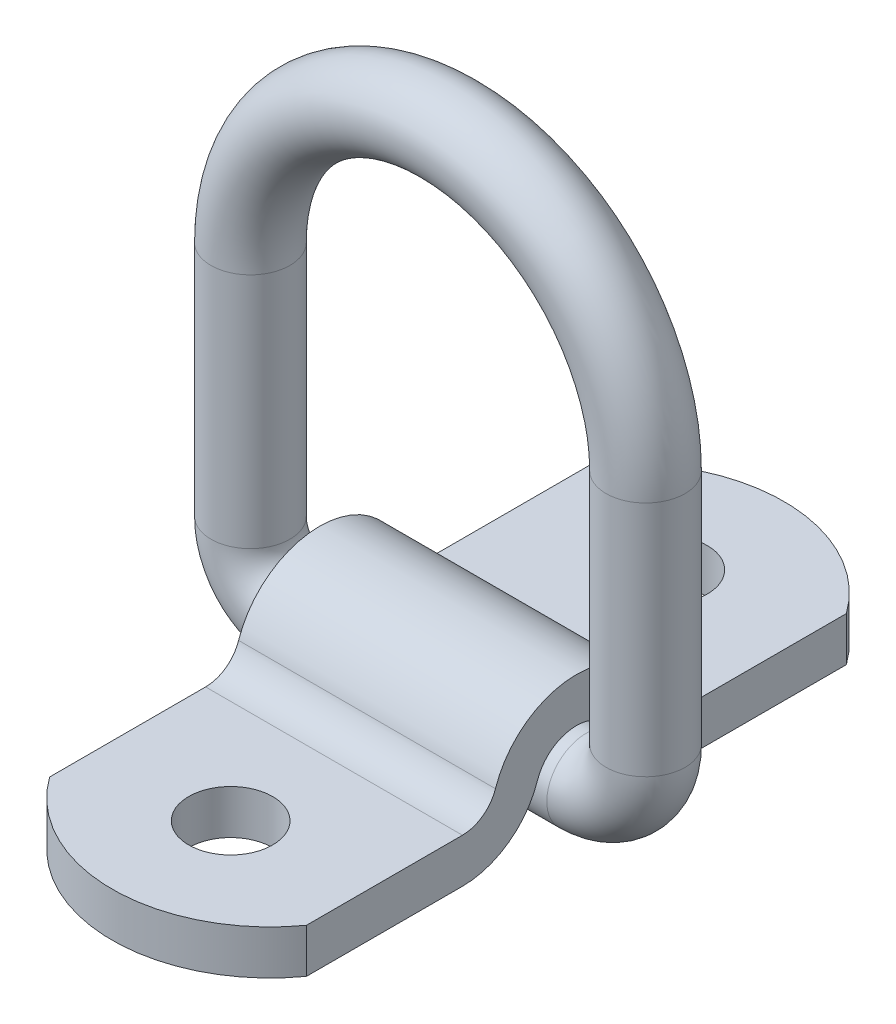
ISO-10303-21;
HEADER;
FILE_DESCRIPTION(('STEP AP214'),'2;1');
FILE_NAME('part.step','',(''),(''),'','','');
FILE_SCHEMA(('AUTOMOTIVE_DESIGN { 1 0 10303 214 1 1 1 1 }'));
ENDSEC;
DATA;
#1=APPLICATION_CONTEXT('core data for automotive mechanical design processes');
#2=APPLICATION_PROTOCOL_DEFINITION('international standard','automotive_design',2000,#1);
#3=PRODUCT_CONTEXT('',#1,'mechanical');
#4=PRODUCT('Part','Part','',(#3));
#5=PRODUCT_RELATED_PRODUCT_CATEGORY('part','',(#4));
#6=PRODUCT_DEFINITION_FORMATION('','',#4);
#7=PRODUCT_DEFINITION_CONTEXT('part definition',#1,'design');
#8=PRODUCT_DEFINITION('design','',#6,#7);
#9=PRODUCT_DEFINITION_SHAPE('','',#8);
#10=(LENGTH_UNIT() NAMED_UNIT(*) SI_UNIT(.MILLI.,.METRE.));
#11=(NAMED_UNIT(*) PLANE_ANGLE_UNIT() SI_UNIT($,.RADIAN.));
#12=(NAMED_UNIT(*) SI_UNIT($,.STERADIAN.) SOLID_ANGLE_UNIT());
#13=UNCERTAINTY_MEASURE_WITH_UNIT(LENGTH_MEASURE(1.E-05),#10,'distance_accuracy_value','');
#14=(GEOMETRIC_REPRESENTATION_CONTEXT(3) GLOBAL_UNCERTAINTY_ASSIGNED_CONTEXT((#13)) GLOBAL_UNIT_ASSIGNED_CONTEXT((#10,
#11,#12)) REPRESENTATION_CONTEXT('',''));
#15=CARTESIAN_POINT('',(0.,0.,0.));
#16=DIRECTION('',(0.,0.,1.));
#17=DIRECTION('',(1.,0.,0.));
#18=AXIS2_PLACEMENT_3D('',#15,#16,#17);
#19=CARTESIAN_POINT('',(10.31875,-3.302,26.9875));
#20=DIRECTION('',(0.,1.,0.));
#21=DIRECTION('',(0.,0.,1.));
#22=AXIS2_PLACEMENT_3D('',#19,#20,#21);
#23=PLANE('',#22);
#24=CARTESIAN_POINT('',(0.,-3.302,17.4625));
#25=DIRECTION('',(0.,-1.,0.));
#26=DIRECTION('',(0.,0.,-1.));
#27=AXIS2_PLACEMENT_3D('',#24,#25,#26);
#28=CIRCLE('',#27,3.3734375);
#29=CARTESIAN_POINT('',(0.,-3.302,14.0890625));
#30=VERTEX_POINT('',#29);
#31=EDGE_CURVE('E211',#30,#30,#28,.T.);
#32=ORIENTED_EDGE('',*,*,#31,.F.);
#33=EDGE_LOOP('',(#32));
#34=FACE_BOUND('',#33,.T.);
#35=CARTESIAN_POINT('',(0.,-3.302,14.2875));
#36=DIRECTION('',(0.,1.,0.));
#37=DIRECTION('',(0.,0.,-1.));
#38=AXIS2_PLACEMENT_3D('',#35,#36,#37);
#39=CIRCLE('',#38,12.7);
#40=CARTESIAN_POINT('',(-10.31875,-3.302,21.6911071233893));
#41=VERTEX_POINT('',#40);
#42=CARTESIAN_POINT('',(10.31875,-3.302,21.6911071233892));
#43=VERTEX_POINT('',#42);
#44=EDGE_CURVE('E210',#41,#43,#39,.T.);
#45=ORIENTED_EDGE('',*,*,#44,.F.);
#46=DIRECTION('',(0.,0.,-1.));
#47=VECTOR('',#46,1.);
#48=CARTESIAN_POINT('',(-10.31875,-3.302,26.9875));
#49=LINE('',#48,#47);
#50=CARTESIAN_POINT('',(-10.31875,-3.302,9.15810023967853));
#51=VERTEX_POINT('',#50);
#52=EDGE_CURVE('E164',#41,#51,#49,.T.);
#53=ORIENTED_EDGE('',*,*,#52,.T.);
#54=DIRECTION('',(-1.,0.,0.));
#55=VECTOR('',#54,1.);
#56=CARTESIAN_POINT('',(10.31875,-3.302,9.15810023967853));
#57=LINE('',#56,#55);
#58=CARTESIAN_POINT('',(10.31875,-3.302,9.15810023967853));
#59=VERTEX_POINT('',#58);
#60=EDGE_CURVE('E204',#59,#51,#57,.T.);
#61=ORIENTED_EDGE('',*,*,#60,.F.);
#62=DIRECTION('',(0.,0.,-1.));
#63=VECTOR('',#62,1.);
#64=CARTESIAN_POINT('',(10.31875,-3.302,26.9875));
#65=LINE('',#64,#63);
#66=EDGE_CURVE('E184',#43,#59,#65,.T.);
#67=ORIENTED_EDGE('',*,*,#66,.F.);
#68=EDGE_LOOP('',(#45,#53,#61,#67));
#69=FACE_BOUND('',#68,.T.);
#70=ADVANCED_FACE('F40',(#34,#69),#23,.F.);
#71=CARTESIAN_POINT('',(10.31875,3.048,9.15810023967853));
#72=DIRECTION('',(-1.,0.,0.));
#73=DIRECTION('',(0.,0.,1.));
#74=AXIS2_PLACEMENT_3D('',#71,#72,#73);
#75=CYLINDRICAL_SURFACE('',#74,6.35);
#76=CARTESIAN_POINT('',(-10.31875,3.048,9.15810023967853));
#77=DIRECTION('',(1.,0.,0.));
#78=DIRECTION('',(0.,0.,-1.));
#79=AXIS2_PLACEMENT_3D('',#76,#77,#78);
#80=CIRCLE('',#79,6.35);
#81=CARTESIAN_POINT('',(-10.31875,1.04273684210526,3.1330342925216));
#82=VERTEX_POINT('',#81);
#83=EDGE_CURVE('E166',#51,#82,#80,.T.);
#84=ORIENTED_EDGE('',*,*,#83,.T.);
#85=DIRECTION('',(-1.,0.,0.));
#86=VECTOR('',#85,1.);
#87=CARTESIAN_POINT('',(10.31875,1.04273684210526,3.1330342925216));
#88=LINE('',#87,#86);
#89=CARTESIAN_POINT('',(10.31875,1.04273684210526,3.1330342925216));
#90=VERTEX_POINT('',#89);
#91=EDGE_CURVE('E201',#90,#82,#88,.T.);
#92=ORIENTED_EDGE('',*,*,#91,.F.);
#93=CARTESIAN_POINT('',(10.31875,3.048,9.15810023967853));
#94=DIRECTION('',(1.,0.,0.));
#95=DIRECTION('',(0.,0.,-1.));
#96=AXIS2_PLACEMENT_3D('',#93,#94,#95);
#97=CIRCLE('',#96,6.35);
#98=EDGE_CURVE('E231',#59,#90,#97,.T.);
#99=ORIENTED_EDGE('',*,*,#98,.F.);
#100=ORIENTED_EDGE('',*,*,#60,.T.);
#101=EDGE_LOOP('',(#84,#92,#99,#100));
#102=FACE_BOUND('',#101,.T.);
#103=ADVANCED_FACE('F274',(#102),#75,.T.);
#104=CARTESIAN_POINT('',(10.31875,0.,0.));
#105=DIRECTION('',(-1.,0.,0.));
#106=DIRECTION('',(0.,0.,1.));
#107=AXIS2_PLACEMENT_3D('',#104,#105,#106);
#108=CYLINDRICAL_SURFACE('',#107,3.302);
#109=CARTESIAN_POINT('',(-10.31875,0.,0.));
#110=DIRECTION('',(-1.,0.,0.));
#111=DIRECTION('',(0.,0.,1.));
#112=AXIS2_PLACEMENT_3D('',#109,#110,#111);
#113=CIRCLE('',#112,3.302);
#114=CARTESIAN_POINT('',(-10.31875,1.04273684210526,-3.13303429252161));
#115=VERTEX_POINT('',#114);
#116=EDGE_CURVE('E168',#82,#115,#113,.T.);
#117=ORIENTED_EDGE('',*,*,#116,.T.);
#118=DIRECTION('',(-1.,0.,0.));
#119=VECTOR('',#118,1.);
#120=CARTESIAN_POINT('',(10.31875,1.04273684210526,-3.13303429252161));
#121=LINE('',#120,#119);
#122=CARTESIAN_POINT('',(10.31875,1.04273684210526,-3.13303429252161));
#123=VERTEX_POINT('',#122);
#124=EDGE_CURVE('E198',#123,#115,#121,.T.);
#125=ORIENTED_EDGE('',*,*,#124,.F.);
#126=CARTESIAN_POINT('',(10.31875,0.,0.));
#127=DIRECTION('',(-1.,0.,0.));
#128=DIRECTION('',(0.,0.,1.));
#129=AXIS2_PLACEMENT_3D('',#126,#127,#128);
#130=CIRCLE('',#129,3.302);
#131=EDGE_CURVE('E151',#90,#123,#130,.T.);
#132=ORIENTED_EDGE('',*,*,#131,.F.);
#133=ORIENTED_EDGE('',*,*,#91,.T.);
#134=EDGE_LOOP('',(#117,#125,#132,#133));
#135=FACE_BOUND('',#134,.T.);
#136=ADVANCED_FACE('F237',(#135),#108,.F.);
#137=CARTESIAN_POINT('',(10.31875,3.048,-9.15810023967853));
#138=DIRECTION('',(-1.,0.,0.));
#139=DIRECTION('',(0.,0.,1.));
#140=AXIS2_PLACEMENT_3D('',#137,#138,#139);
#141=CYLINDRICAL_SURFACE('',#140,6.35);
#142=CARTESIAN_POINT('',(-10.31875,3.048,-9.15810023967853));
#143=DIRECTION('',(1.,0.,0.));
#144=DIRECTION('',(0.,0.,1.));
#145=AXIS2_PLACEMENT_3D('',#142,#143,#144);
#146=CIRCLE('',#145,6.35);
#147=CARTESIAN_POINT('',(-10.31875,-3.302,-9.15810023967853));
#148=VERTEX_POINT('',#147);
#149=EDGE_CURVE('E170',#115,#148,#146,.T.);
#150=ORIENTED_EDGE('',*,*,#149,.T.);
#151=DIRECTION('',(-1.,0.,0.));
#152=VECTOR('',#151,1.);
#153=CARTESIAN_POINT('',(10.31875,-3.302,-9.15810023967853));
#154=LINE('',#153,#152);
#155=CARTESIAN_POINT('',(10.31875,-3.302,-9.15810023967853));
#156=VERTEX_POINT('',#155);
#157=EDGE_CURVE('E196',#156,#148,#154,.T.);
#158=ORIENTED_EDGE('',*,*,#157,.F.);
#159=CARTESIAN_POINT('',(10.31875,3.048,-9.15810023967853));
#160=DIRECTION('',(1.,0.,0.));
#161=DIRECTION('',(0.,0.,1.));
#162=AXIS2_PLACEMENT_3D('',#159,#160,#161);
#163=CIRCLE('',#162,6.35);
#164=EDGE_CURVE('E145',#123,#156,#163,.T.);
#165=ORIENTED_EDGE('',*,*,#164,.F.);
#166=ORIENTED_EDGE('',*,*,#124,.T.);
#167=EDGE_LOOP('',(#150,#158,#165,#166));
#168=FACE_BOUND('',#167,.T.);
#169=ADVANCED_FACE('F241',(#168),#141,.T.);
#170=CARTESIAN_POINT('',(10.31875,-3.30199999999999,-26.9875));
#171=DIRECTION('',(0.,1.,0.));
#172=DIRECTION('',(0.,0.,1.));
#173=AXIS2_PLACEMENT_3D('',#170,#171,#172);
#174=PLANE('',#173);
#175=CARTESIAN_POINT('',(0.,-3.302,-17.4625));
#176=DIRECTION('',(0.,-1.,0.));
#177=DIRECTION('',(0.,0.,1.));
#178=AXIS2_PLACEMENT_3D('',#175,#176,#177);
#179=CIRCLE('',#178,3.3734375);
#180=CARTESIAN_POINT('',(0.,-3.302,-14.0890625));
#181=VERTEX_POINT('',#180);
#182=EDGE_CURVE('E214',#181,#181,#179,.T.);
#183=ORIENTED_EDGE('',*,*,#182,.F.);
#184=EDGE_LOOP('',(#183));
#185=FACE_BOUND('',#184,.T.);
#186=DIRECTION('',(0.,0.,-1.));
#187=VECTOR('',#186,1.);
#188=CARTESIAN_POINT('',(-10.31875,-3.30199999999999,-26.9875));
#189=LINE('',#188,#187);
#190=CARTESIAN_POINT('',(-10.31875,-3.302,-21.6911071233892));
#191=VERTEX_POINT('',#190);
#192=EDGE_CURVE('E141',#148,#191,#189,.T.);
#193=ORIENTED_EDGE('',*,*,#192,.T.);
#194=CARTESIAN_POINT('',(0.,-3.302,-14.2875));
#195=DIRECTION('',(0.,1.,0.));
#196=DIRECTION('',(0.,0.,1.));
#197=AXIS2_PLACEMENT_3D('',#194,#195,#196);
#198=CIRCLE('',#197,12.7);
#199=CARTESIAN_POINT('',(10.31875,-3.302,-21.6911071233892));
#200=VERTEX_POINT('',#199);
#201=EDGE_CURVE('E54',#200,#191,#198,.T.);
#202=ORIENTED_EDGE('',*,*,#201,.F.);
#203=DIRECTION('',(0.,0.,-1.));
#204=VECTOR('',#203,1.);
#205=CARTESIAN_POINT('',(10.31875,-3.30199999999999,-26.9875));
#206=LINE('',#205,#204);
#207=EDGE_CURVE('E139',#156,#200,#206,.T.);
#208=ORIENTED_EDGE('',*,*,#207,.F.);
#209=ORIENTED_EDGE('',*,*,#157,.T.);
#210=EDGE_LOOP('',(#193,#202,#208,#209));
#211=FACE_BOUND('',#210,.T.);
#212=ADVANCED_FACE('F137',(#185,#211),#174,.F.);
#213=CARTESIAN_POINT('',(10.31875,0.254000000000007,-26.9875));
#214=DIRECTION('',(0.,-1.,0.));
#215=DIRECTION('',(0.,0.,-1.));
#216=AXIS2_PLACEMENT_3D('',#213,#214,#215);
#217=PLANE('',#216);
#218=CARTESIAN_POINT('',(0.,0.254000000000004,-17.4625));
#219=DIRECTION('',(0.,-1.,0.));
#220=DIRECTION('',(0.,0.,-1.));
#221=AXIS2_PLACEMENT_3D('',#218,#219,#220);
#222=CIRCLE('',#221,3.3734375);
#223=CARTESIAN_POINT('',(0.,0.254000000000005,-20.8359375));
#224=VERTEX_POINT('',#223);
#225=EDGE_CURVE('E212',#224,#224,#222,.T.);
#226=ORIENTED_EDGE('',*,*,#225,.T.);
#227=EDGE_LOOP('',(#226));
#228=FACE_BOUND('',#227,.T.);
#229=DIRECTION('',(0.,0.,1.));
#230=VECTOR('',#229,1.);
#231=CARTESIAN_POINT('',(10.31875,0.254000000000007,-26.9875));
#232=LINE('',#231,#230);
#233=CARTESIAN_POINT('',(10.31875,0.254000000000004,-21.6911071233892));
#234=VERTEX_POINT('',#233);
#235=CARTESIAN_POINT('',(10.31875,0.254000000000002,-9.15810023967853));
#236=VERTEX_POINT('',#235);
#237=EDGE_CURVE('E147',#234,#236,#232,.T.);
#238=ORIENTED_EDGE('',*,*,#237,.F.);
#239=CARTESIAN_POINT('',(0.,0.254000000000004,-14.2875));
#240=DIRECTION('',(0.,-1.,0.));
#241=DIRECTION('',(0.,0.,-1.));
#242=AXIS2_PLACEMENT_3D('',#239,#240,#241);
#243=CIRCLE('',#242,12.7);
#244=CARTESIAN_POINT('',(-10.31875,0.254000000000004,-21.6911071233893));
#245=VERTEX_POINT('',#244);
#246=EDGE_CURVE('E129',#234,#245,#243,.F.);
#247=ORIENTED_EDGE('',*,*,#246,.T.);
#248=DIRECTION('',(0.,0.,1.));
#249=VECTOR('',#248,1.);
#250=CARTESIAN_POINT('',(-10.31875,0.254000000000007,-26.9875));
#251=LINE('',#250,#249);
#252=CARTESIAN_POINT('',(-10.31875,0.254000000000002,-9.15810023967853));
#253=VERTEX_POINT('',#252);
#254=EDGE_CURVE('E173',#245,#253,#251,.T.);
#255=ORIENTED_EDGE('',*,*,#254,.T.);
#256=DIRECTION('',(-1.,0.,0.));
#257=VECTOR('',#256,1.);
#258=CARTESIAN_POINT('',(10.31875,0.254000000000002,-9.15810023967853));
#259=LINE('',#258,#257);
#260=EDGE_CURVE('E193',#236,#253,#259,.T.);
#261=ORIENTED_EDGE('',*,*,#260,.F.);
#262=EDGE_LOOP('',(#238,#247,#255,#261));
#263=FACE_BOUND('',#262,.T.);
#264=ADVANCED_FACE('F247',(#228,#263),#217,.F.);
#265=CARTESIAN_POINT('',(10.31875,3.048,-9.15810023967853));
#266=DIRECTION('',(-1.,0.,0.));
#267=DIRECTION('',(0.,0.,1.));
#268=AXIS2_PLACEMENT_3D('',#265,#266,#267);
#269=CYLINDRICAL_SURFACE('',#268,2.794);
#270=CARTESIAN_POINT('',(-10.31875,3.048,-9.15810023967853));
#271=DIRECTION('',(-1.,0.,0.));
#272=DIRECTION('',(0.,0.,1.));
#273=AXIS2_PLACEMENT_3D('',#270,#271,#272);
#274=CIRCLE('',#273,2.794);
#275=CARTESIAN_POINT('',(-10.31875,2.16568421052631,-6.50707122292949));
#276=VERTEX_POINT('',#275);
#277=EDGE_CURVE('E175',#253,#276,#274,.T.);
#278=ORIENTED_EDGE('',*,*,#277,.T.);
#279=DIRECTION('',(-1.,0.,0.));
#280=VECTOR('',#279,1.);
#281=CARTESIAN_POINT('',(10.31875,2.16568421052631,-6.50707122292949));
#282=LINE('',#281,#280);
#283=CARTESIAN_POINT('',(10.31875,2.16568421052631,-6.50707122292949));
#284=VERTEX_POINT('',#283);
#285=EDGE_CURVE('E190',#284,#276,#282,.T.);
#286=ORIENTED_EDGE('',*,*,#285,.F.);
#287=CARTESIAN_POINT('',(10.31875,3.048,-9.15810023967853));
#288=DIRECTION('',(-1.,0.,0.));
#289=DIRECTION('',(0.,0.,1.));
#290=AXIS2_PLACEMENT_3D('',#287,#288,#289);
#291=CIRCLE('',#290,2.794);
#292=EDGE_CURVE('E149',#236,#284,#291,.T.);
#293=ORIENTED_EDGE('',*,*,#292,.F.);
#294=ORIENTED_EDGE('',*,*,#260,.T.);
#295=EDGE_LOOP('',(#278,#286,#293,#294));
#296=FACE_BOUND('',#295,.T.);
#297=ADVANCED_FACE('F254',(#296),#269,.F.);
#298=CARTESIAN_POINT('',(10.31875,0.,0.));
#299=DIRECTION('',(-1.,0.,0.));
#300=DIRECTION('',(0.,0.,1.));
#301=AXIS2_PLACEMENT_3D('',#298,#299,#300);
#302=CYLINDRICAL_SURFACE('',#301,6.858);
#303=CARTESIAN_POINT('',(-10.31875,0.,0.));
#304=DIRECTION('',(1.,0.,0.));
#305=DIRECTION('',(0.,0.,1.));
#306=AXIS2_PLACEMENT_3D('',#303,#304,#305);
#307=CIRCLE('',#306,6.858);
#308=CARTESIAN_POINT('',(-10.31875,2.16568421052631,6.50707122292949));
#309=VERTEX_POINT('',#308);
#310=EDGE_CURVE('E177',#276,#309,#307,.T.);
#311=ORIENTED_EDGE('',*,*,#310,.T.);
#312=DIRECTION('',(-1.,0.,0.));
#313=VECTOR('',#312,1.);
#314=CARTESIAN_POINT('',(10.31875,2.16568421052631,6.50707122292949));
#315=LINE('',#314,#313);
#316=CARTESIAN_POINT('',(10.31875,2.16568421052631,6.50707122292949));
#317=VERTEX_POINT('',#316);
#318=EDGE_CURVE('E187',#317,#309,#315,.T.);
#319=ORIENTED_EDGE('',*,*,#318,.F.);
#320=CARTESIAN_POINT('',(10.31875,0.,0.));
#321=DIRECTION('',(1.,0.,0.));
#322=DIRECTION('',(0.,0.,1.));
#323=AXIS2_PLACEMENT_3D('',#320,#321,#322);
#324=CIRCLE('',#323,6.858);
#325=EDGE_CURVE('E156',#284,#317,#324,.T.);
#326=ORIENTED_EDGE('',*,*,#325,.F.);
#327=ORIENTED_EDGE('',*,*,#285,.T.);
#328=EDGE_LOOP('',(#311,#319,#326,#327));
#329=FACE_BOUND('',#328,.T.);
#330=ADVANCED_FACE('F257',(#329),#302,.T.);
#331=CARTESIAN_POINT('',(10.31875,3.048,9.15810023967853));
#332=DIRECTION('',(-1.,0.,0.));
#333=DIRECTION('',(0.,0.,1.));
#334=AXIS2_PLACEMENT_3D('',#331,#332,#333);
#335=CYLINDRICAL_SURFACE('',#334,2.794);
#336=CARTESIAN_POINT('',(-10.31875,3.048,9.15810023967853));
#337=DIRECTION('',(-1.,0.,0.));
#338=DIRECTION('',(0.,0.,-1.));
#339=AXIS2_PLACEMENT_3D('',#336,#337,#338);
#340=CIRCLE('',#339,2.794);
#341=CARTESIAN_POINT('',(-10.31875,0.254,9.15810023967853));
#342=VERTEX_POINT('',#341);
#343=EDGE_CURVE('E179',#309,#342,#340,.T.);
#344=ORIENTED_EDGE('',*,*,#343,.T.);
#345=DIRECTION('',(-1.,0.,0.));
#346=VECTOR('',#345,1.);
#347=CARTESIAN_POINT('',(10.31875,0.254,9.15810023967853));
#348=LINE('',#347,#346);
#349=CARTESIAN_POINT('',(10.31875,0.254,9.15810023967853));
#350=VERTEX_POINT('',#349);
#351=EDGE_CURVE('E163',#350,#342,#348,.T.);
#352=ORIENTED_EDGE('',*,*,#351,.F.);
#353=CARTESIAN_POINT('',(10.31875,3.048,9.15810023967853));
#354=DIRECTION('',(-1.,0.,0.));
#355=DIRECTION('',(0.,0.,-1.));
#356=AXIS2_PLACEMENT_3D('',#353,#354,#355);
#357=CIRCLE('',#356,2.794);
#358=EDGE_CURVE('E158',#317,#350,#357,.T.);
#359=ORIENTED_EDGE('',*,*,#358,.F.);
#360=ORIENTED_EDGE('',*,*,#318,.T.);
#361=EDGE_LOOP('',(#344,#352,#359,#360));
#362=FACE_BOUND('',#361,.T.);
#363=ADVANCED_FACE('F262',(#362),#335,.F.);
#364=CARTESIAN_POINT('',(10.31875,0.254,26.9875));
#365=DIRECTION('',(0.,-1.,0.));
#366=DIRECTION('',(0.,0.,-1.));
#367=AXIS2_PLACEMENT_3D('',#364,#365,#366);
#368=PLANE('',#367);
#369=CARTESIAN_POINT('',(0.,0.253999999999997,17.4625));
#370=DIRECTION('',(0.,-1.,0.));
#371=DIRECTION('',(0.,0.,-1.));
#372=AXIS2_PLACEMENT_3D('',#369,#370,#371);
#373=CIRCLE('',#372,3.3734375);
#374=CARTESIAN_POINT('',(0.,0.253999999999997,14.0890625));
#375=VERTEX_POINT('',#374);
#376=EDGE_CURVE('E208',#375,#375,#373,.T.);
#377=ORIENTED_EDGE('',*,*,#376,.T.);
#378=EDGE_LOOP('',(#377));
#379=FACE_BOUND('',#378,.T.);
#380=DIRECTION('',(0.,0.,1.));
#381=VECTOR('',#380,1.);
#382=CARTESIAN_POINT('',(-10.31875,0.254,26.9875));
#383=LINE('',#382,#381);
#384=CARTESIAN_POINT('',(-10.31875,0.254,21.6911071233893));
#385=VERTEX_POINT('',#384);
#386=EDGE_CURVE('E181',#342,#385,#383,.T.);
#387=ORIENTED_EDGE('',*,*,#386,.T.);
#388=CARTESIAN_POINT('',(0.,0.253999999999997,14.2875));
#389=DIRECTION('',(0.,-1.,0.));
#390=DIRECTION('',(0.,0.,-1.));
#391=AXIS2_PLACEMENT_3D('',#388,#389,#390);
#392=CIRCLE('',#391,12.7);
#393=CARTESIAN_POINT('',(10.31875,0.253999999999997,21.6911071233892));
#394=VERTEX_POINT('',#393);
#395=EDGE_CURVE('E61',#385,#394,#392,.F.);
#396=ORIENTED_EDGE('',*,*,#395,.T.);
#397=DIRECTION('',(0.,0.,1.));
#398=VECTOR('',#397,1.);
#399=CARTESIAN_POINT('',(10.31875,0.254,26.9875));
#400=LINE('',#399,#398);
#401=EDGE_CURVE('E160',#350,#394,#400,.T.);
#402=ORIENTED_EDGE('',*,*,#401,.F.);
#403=ORIENTED_EDGE('',*,*,#351,.T.);
#404=EDGE_LOOP('',(#387,#396,#402,#403));
#405=FACE_BOUND('',#404,.T.);
#406=ADVANCED_FACE('F266',(#379,#405),#368,.F.);
#407=CARTESIAN_POINT('',(10.31875,3.048,9.15810023967853));
#408=DIRECTION('',(1.,0.,0.));
#409=DIRECTION('',(0.,0.,-1.));
#410=AXIS2_PLACEMENT_3D('',#407,#408,#409);
#411=PLANE('',#410);
#412=DIRECTION('',(0.,-1.,0.));
#413=VECTOR('',#412,1.);
#414=CARTESIAN_POINT('',(10.31875,42.8625,-21.6911071233892));
#415=LINE('',#414,#413);
#416=EDGE_CURVE('E126',#234,#200,#415,.T.);
#417=ORIENTED_EDGE('',*,*,#416,.F.);
#418=ORIENTED_EDGE('',*,*,#237,.T.);
#419=ORIENTED_EDGE('',*,*,#292,.T.);
#420=ORIENTED_EDGE('',*,*,#325,.T.);
#421=ORIENTED_EDGE('',*,*,#358,.T.);
#422=ORIENTED_EDGE('',*,*,#401,.T.);
#423=DIRECTION('',(0.,-1.,0.));
#424=VECTOR('',#423,1.);
#425=CARTESIAN_POINT('',(10.31875,42.8625,21.6911071233893));
#426=LINE('',#425,#424);
#427=EDGE_CURVE('E226',#394,#43,#426,.T.);
#428=ORIENTED_EDGE('',*,*,#427,.T.);
#429=ORIENTED_EDGE('',*,*,#66,.T.);
#430=ORIENTED_EDGE('',*,*,#98,.T.);
#431=ORIENTED_EDGE('',*,*,#131,.T.);
#432=ORIENTED_EDGE('',*,*,#164,.T.);
#433=ORIENTED_EDGE('',*,*,#207,.T.);
#434=EDGE_LOOP('',(#417,#418,#419,#420,#421,#422,#428,#429,#430,#431,#432,#433));
#435=FACE_BOUND('',#434,.T.);
#436=ADVANCED_FACE('F143',(#435),#411,.T.);
#437=CARTESIAN_POINT('',(-10.31875,3.048,9.15810023967853));
#438=DIRECTION('',(1.,0.,0.));
#439=DIRECTION('',(0.,0.,-1.));
#440=AXIS2_PLACEMENT_3D('',#437,#438,#439);
#441=PLANE('',#440);
#442=ORIENTED_EDGE('',*,*,#254,.F.);
#443=DIRECTION('',(0.,-1.,0.));
#444=VECTOR('',#443,1.);
#445=CARTESIAN_POINT('',(-10.31875,42.8625,-21.6911071233893));
#446=LINE('',#445,#444);
#447=EDGE_CURVE('E12',#245,#191,#446,.T.);
#448=ORIENTED_EDGE('',*,*,#447,.T.);
#449=ORIENTED_EDGE('',*,*,#192,.F.);
#450=ORIENTED_EDGE('',*,*,#149,.F.);
#451=ORIENTED_EDGE('',*,*,#116,.F.);
#452=ORIENTED_EDGE('',*,*,#83,.F.);
#453=ORIENTED_EDGE('',*,*,#52,.F.);
#454=DIRECTION('',(0.,-1.,0.));
#455=VECTOR('',#454,1.);
#456=CARTESIAN_POINT('',(-10.31875,42.8625,21.6911071233893));
#457=LINE('',#456,#455);
#458=EDGE_CURVE('E47',#41,#385,#457,.F.);
#459=ORIENTED_EDGE('',*,*,#458,.T.);
#460=ORIENTED_EDGE('',*,*,#386,.F.);
#461=ORIENTED_EDGE('',*,*,#343,.F.);
#462=ORIENTED_EDGE('',*,*,#310,.F.);
#463=ORIENTED_EDGE('',*,*,#277,.F.);
#464=EDGE_LOOP('',(#442,#448,#449,#450,#451,#452,#453,#459,#460,#461,#462,#463));
#465=FACE_BOUND('',#464,.T.);
#466=ADVANCED_FACE('F244',(#465),#441,.F.);
#467=CARTESIAN_POINT('',(0.,42.8625,14.2875));
#468=DIRECTION('',(0.,-1.,0.));
#469=DIRECTION('',(0.,0.,-1.));
#470=AXIS2_PLACEMENT_3D('',#467,#468,#469);
#471=CYLINDRICAL_SURFACE('',#470,12.7);
#472=ORIENTED_EDGE('',*,*,#458,.F.);
#473=ORIENTED_EDGE('',*,*,#44,.T.);
#474=ORIENTED_EDGE('',*,*,#427,.F.);
#475=ORIENTED_EDGE('',*,*,#395,.F.);
#476=EDGE_LOOP('',(#472,#473,#474,#475));
#477=FACE_BOUND('',#476,.T.);
#478=ADVANCED_FACE('F268',(#477),#471,.T.);
#479=CARTESIAN_POINT('',(0.,42.8625,17.4625));
#480=DIRECTION('',(0.,-1.,0.));
#481=DIRECTION('',(0.,0.,-1.));
#482=AXIS2_PLACEMENT_3D('',#479,#480,#481);
#483=CYLINDRICAL_SURFACE('',#482,3.3734375);
#484=ORIENTED_EDGE('',*,*,#31,.T.);
#485=EDGE_LOOP('',(#484));
#486=FACE_BOUND('',#485,.T.);
#487=ORIENTED_EDGE('',*,*,#376,.F.);
#488=EDGE_LOOP('',(#487));
#489=FACE_BOUND('',#488,.T.);
#490=ADVANCED_FACE('F305',(#486,#489),#483,.F.);
#491=CARTESIAN_POINT('',(0.,42.8625,-17.4625));
#492=DIRECTION('',(0.,-1.,0.));
#493=DIRECTION('',(0.,0.,-1.));
#494=AXIS2_PLACEMENT_3D('',#491,#492,#493);
#495=CYLINDRICAL_SURFACE('',#494,3.3734375);
#496=ORIENTED_EDGE('',*,*,#182,.T.);
#497=EDGE_LOOP('',(#496));
#498=FACE_BOUND('',#497,.T.);
#499=ORIENTED_EDGE('',*,*,#225,.F.);
#500=EDGE_LOOP('',(#499));
#501=FACE_BOUND('',#500,.T.);
#502=ADVANCED_FACE('F308',(#498,#501),#495,.F.);
#503=CARTESIAN_POINT('',(0.,42.8625,-14.2875));
#504=DIRECTION('',(0.,-1.,0.));
#505=DIRECTION('',(0.,0.,-1.));
#506=AXIS2_PLACEMENT_3D('',#503,#504,#505);
#507=CYLINDRICAL_SURFACE('',#506,12.7);
#508=ORIENTED_EDGE('',*,*,#201,.T.);
#509=ORIENTED_EDGE('',*,*,#447,.F.);
#510=ORIENTED_EDGE('',*,*,#246,.F.);
#511=ORIENTED_EDGE('',*,*,#416,.T.);
#512=EDGE_LOOP('',(#508,#509,#510,#511));
#513=FACE_BOUND('',#512,.T.);
#514=ADVANCED_FACE('F127',(#513),#507,.T.);
#515=CLOSED_SHELL('',(#70,#103,#136,#169,#212,#264,#297,#330,#363,#406,#436,#466,#478,#490,#502,#514));
#516=MANIFOLD_SOLID_BREP('B2',#515);
#517=CARTESIAN_POINT('',(11.1125,4.7625,0.));
#518=DIRECTION('',(0.,0.,-1.));
#519=DIRECTION('',(-1.,0.,0.));
#520=AXIS2_PLACEMENT_3D('',#517,#518,#519);
#521=TOROIDAL_SURFACE('',#520,4.7625,3.175);
#522=CARTESIAN_POINT('',(15.875,4.76250000000001,0.));
#523=DIRECTION('',(0.,1.,0.));
#524=DIRECTION('',(0.,0.,-1.));
#525=AXIS2_PLACEMENT_3D('',#522,#523,#524);
#526=CIRCLE('',#525,3.175);
#527=CARTESIAN_POINT('',(19.05,4.76250000000001,0.));
#528=VERTEX_POINT('',#527);
#529=EDGE_CURVE('E419',#528,#528,#526,.T.);
#530=CARTESIAN_POINT('',(11.1125,0.,0.));
#531=DIRECTION('',(1.,0.,0.));
#532=DIRECTION('',(0.,0.,-1.));
#533=AXIS2_PLACEMENT_3D('',#530,#531,#532);
#534=CIRCLE('',#533,3.175);
#535=CARTESIAN_POINT('',(11.1125,-3.175,0.));
#536=VERTEX_POINT('',#535);
#537=EDGE_CURVE('E39',#536,#536,#534,.T.);
#538=CARTESIAN_POINT('',(11.1125,4.7625,0.));
#539=DIRECTION('',(0.,0.,-1.));
#540=DIRECTION('',(-1.,0.,0.));
#541=AXIS2_PLACEMENT_3D('',#538,#539,#540);
#542=CIRCLE('',#541,7.9375);
#543=EDGE_CURVE('',#528,#536,#542,.T.);
#544=ORIENTED_EDGE('',*,*,#529,.F.);
#545=ORIENTED_EDGE('',*,*,#537,.T.);
#546=ORIENTED_EDGE('',*,*,#543,.T.);
#547=ORIENTED_EDGE('',*,*,#543,.F.);
#548=EDGE_LOOP('',(#544,#546,#545,#547));
#549=FACE_BOUND('',#548,.T.);
#550=ADVANCED_FACE('F413',(#549),#521,.T.);
#551=CARTESIAN_POINT('',(15.875,23.8125,0.));
#552=DIRECTION('',(0.,-1.,0.));
#553=DIRECTION('',(1.,0.,0.));
#554=AXIS2_PLACEMENT_3D('',#551,#552,#553);
#555=CYLINDRICAL_SURFACE('',#554,3.175);
#556=CARTESIAN_POINT('',(15.875,23.8125,0.));
#557=DIRECTION('',(0.,1.,0.));
#558=DIRECTION('',(0.,0.,-1.));
#559=AXIS2_PLACEMENT_3D('',#556,#557,#558);
#560=CIRCLE('',#559,3.175);
#561=CARTESIAN_POINT('',(19.05,23.8125,0.));
#562=VERTEX_POINT('',#561);
#563=EDGE_CURVE('E423',#562,#562,#560,.T.);
#564=ORIENTED_EDGE('',*,*,#563,.F.);
#565=EDGE_LOOP('',(#564));
#566=FACE_BOUND('',#565,.T.);
#567=ORIENTED_EDGE('',*,*,#529,.T.);
#568=EDGE_LOOP('',(#567));
#569=FACE_BOUND('',#568,.T.);
#570=ADVANCED_FACE('F457',(#566,#569),#555,.T.);
#571=CARTESIAN_POINT('',(0.,23.8125,0.));
#572=DIRECTION('',(0.,0.,-1.));
#573=DIRECTION('',(-1.,0.,0.));
#574=AXIS2_PLACEMENT_3D('',#571,#572,#573);
#575=TOROIDAL_SURFACE('',#574,15.875,3.175);
#576=CARTESIAN_POINT('',(-15.875,23.8125,0.));
#577=DIRECTION('',(0.,-1.,0.));
#578=DIRECTION('',(0.,0.,-1.));
#579=AXIS2_PLACEMENT_3D('',#576,#577,#578);
#580=CIRCLE('',#579,3.175);
#581=CARTESIAN_POINT('',(-19.05,23.8125,0.));
#582=VERTEX_POINT('',#581);
#583=EDGE_CURVE('E427',#582,#582,#580,.T.);
#584=CARTESIAN_POINT('',(0.,23.8125,0.));
#585=DIRECTION('',(0.,0.,-1.));
#586=DIRECTION('',(-1.,0.,0.));
#587=AXIS2_PLACEMENT_3D('',#584,#585,#586);
#588=CIRCLE('',#587,19.05);
#589=EDGE_CURVE('',#582,#562,#588,.T.);
#590=ORIENTED_EDGE('',*,*,#583,.F.);
#591=ORIENTED_EDGE('',*,*,#563,.T.);
#592=ORIENTED_EDGE('',*,*,#589,.T.);
#593=ORIENTED_EDGE('',*,*,#589,.F.);
#594=EDGE_LOOP('',(#590,#592,#591,#593));
#595=FACE_BOUND('',#594,.T.);
#596=ADVANCED_FACE('F451',(#595),#575,.T.);
#597=CARTESIAN_POINT('',(-15.875,4.76250000000001,0.));
#598=DIRECTION('',(0.,1.,0.));
#599=DIRECTION('',(-1.,0.,0.));
#600=AXIS2_PLACEMENT_3D('',#597,#598,#599);
#601=CYLINDRICAL_SURFACE('',#600,3.175);
#602=CARTESIAN_POINT('',(-15.875,4.76250000000001,0.));
#603=DIRECTION('',(0.,-1.,0.));
#604=DIRECTION('',(0.,0.,-1.));
#605=AXIS2_PLACEMENT_3D('',#602,#603,#604);
#606=CIRCLE('',#605,3.175);
#607=CARTESIAN_POINT('',(-19.05,4.76250000000001,0.));
#608=VERTEX_POINT('',#607);
#609=EDGE_CURVE('E432',#608,#608,#606,.T.);
#610=ORIENTED_EDGE('',*,*,#609,.F.);
#611=EDGE_LOOP('',(#610));
#612=FACE_BOUND('',#611,.T.);
#613=ORIENTED_EDGE('',*,*,#583,.T.);
#614=EDGE_LOOP('',(#613));
#615=FACE_BOUND('',#614,.T.);
#616=ADVANCED_FACE('F445',(#612,#615),#601,.T.);
#617=CARTESIAN_POINT('',(-11.1125,4.7625,0.));
#618=DIRECTION('',(0.,0.,-1.));
#619=DIRECTION('',(-1.,0.,0.));
#620=AXIS2_PLACEMENT_3D('',#617,#618,#619);
#621=TOROIDAL_SURFACE('',#620,4.7625,3.175);
#622=CARTESIAN_POINT('',(-11.1125,0.,0.));
#623=DIRECTION('',(1.,0.,0.));
#624=DIRECTION('',(0.,0.,-1.));
#625=AXIS2_PLACEMENT_3D('',#622,#623,#624);
#626=CIRCLE('',#625,3.175);
#627=CARTESIAN_POINT('',(-11.1125,-3.175,0.));
#628=VERTEX_POINT('',#627);
#629=EDGE_CURVE('E435',#628,#628,#626,.T.);
#630=CARTESIAN_POINT('',(-11.1125,4.7625,0.));
#631=DIRECTION('',(0.,0.,-1.));
#632=DIRECTION('',(-1.,0.,0.));
#633=AXIS2_PLACEMENT_3D('',#630,#631,#632);
#634=CIRCLE('',#633,7.9375);
#635=EDGE_CURVE('',#628,#608,#634,.T.);
#636=ORIENTED_EDGE('',*,*,#629,.F.);
#637=ORIENTED_EDGE('',*,*,#609,.T.);
#638=ORIENTED_EDGE('',*,*,#635,.T.);
#639=ORIENTED_EDGE('',*,*,#635,.F.);
#640=EDGE_LOOP('',(#636,#638,#637,#639));
#641=FACE_BOUND('',#640,.T.);
#642=ADVANCED_FACE('F442',(#641),#621,.T.);
#643=CARTESIAN_POINT('',(-11.1125,0.,0.));
#644=DIRECTION('',(1.,0.,0.));
#645=DIRECTION('',(0.,0.,-1.));
#646=AXIS2_PLACEMENT_3D('',#643,#644,#645);
#647=CYLINDRICAL_SURFACE('',#646,3.175);
#648=ORIENTED_EDGE('',*,*,#629,.T.);
#649=EDGE_LOOP('',(#648));
#650=FACE_BOUND('',#649,.T.);
#651=ORIENTED_EDGE('',*,*,#537,.F.);
#652=EDGE_LOOP('',(#651));
#653=FACE_BOUND('',#652,.T.);
#654=ADVANCED_FACE('F439',(#650,#653),#647,.T.);
#655=CLOSED_SHELL('',(#550,#570,#596,#616,#642,#654));
#656=MANIFOLD_SOLID_BREP('B6',#655);
#657=ADVANCED_BREP_SHAPE_REPRESENTATION('',(#18,#516,#656),#14);
#658=SHAPE_DEFINITION_REPRESENTATION(#9,#657);
ENDSEC;
END-ISO-10303-21;
